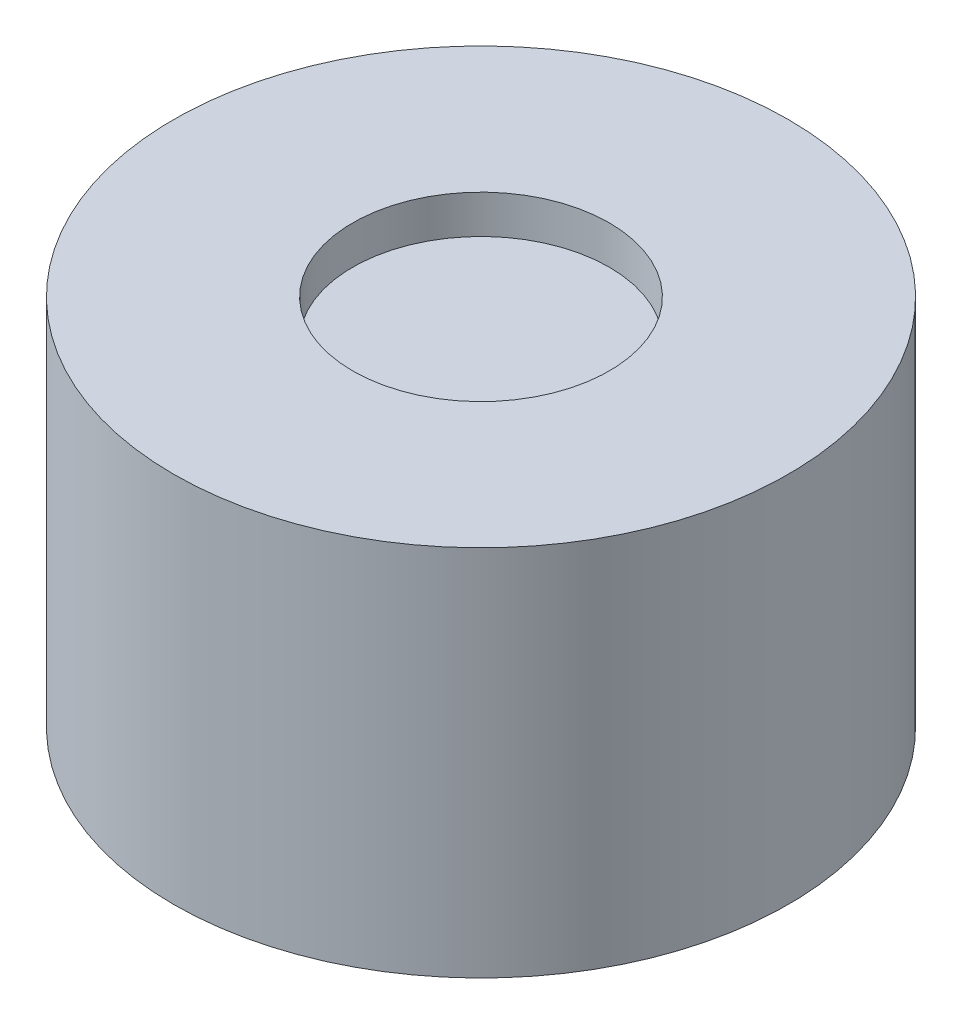
ISO-10303-21;
HEADER;
FILE_DESCRIPTION(('STEP AP214'),'2;1');
FILE_NAME('part.step','',(''),(''),'','','');
FILE_SCHEMA(('AUTOMOTIVE_DESIGN { 1 0 10303 214 1 1 1 1 }'));
ENDSEC;
DATA;
#1=APPLICATION_CONTEXT('core data for automotive mechanical design processes');
#2=APPLICATION_PROTOCOL_DEFINITION('international standard','automotive_design',2000,#1);
#3=PRODUCT_CONTEXT('',#1,'mechanical');
#4=PRODUCT('Part','Part','',(#3));
#5=PRODUCT_RELATED_PRODUCT_CATEGORY('part','',(#4));
#6=PRODUCT_DEFINITION_FORMATION('','',#4);
#7=PRODUCT_DEFINITION_CONTEXT('part definition',#1,'design');
#8=PRODUCT_DEFINITION('design','',#6,#7);
#9=PRODUCT_DEFINITION_SHAPE('','',#8);
#10=(LENGTH_UNIT() NAMED_UNIT(*) SI_UNIT(.MILLI.,.METRE.));
#11=(NAMED_UNIT(*) PLANE_ANGLE_UNIT() SI_UNIT($,.RADIAN.));
#12=(NAMED_UNIT(*) SI_UNIT($,.STERADIAN.) SOLID_ANGLE_UNIT());
#13=UNCERTAINTY_MEASURE_WITH_UNIT(LENGTH_MEASURE(1.E-05),#10,'distance_accuracy_value','');
#14=(GEOMETRIC_REPRESENTATION_CONTEXT(3) GLOBAL_UNCERTAINTY_ASSIGNED_CONTEXT((#13)) GLOBAL_UNIT_ASSIGNED_CONTEXT((#10,
#11,#12)) REPRESENTATION_CONTEXT('',''));
#15=CARTESIAN_POINT('',(0.,0.,0.));
#16=DIRECTION('',(0.,0.,1.));
#17=DIRECTION('',(1.,0.,0.));
#18=AXIS2_PLACEMENT_3D('',#15,#16,#17);
#19=CARTESIAN_POINT('',(0.,48.5,0.));
#20=DIRECTION('',(0.,-1.,0.));
#21=DIRECTION('',(0.,0.,-1.));
#22=AXIS2_PLACEMENT_3D('',#19,#20,#21);
#23=CYLINDRICAL_SURFACE('',#22,40.);
#24=CARTESIAN_POINT('',(0.,48.5,0.));
#25=DIRECTION('',(0.,1.,0.));
#26=DIRECTION('',(0.,0.,1.));
#27=AXIS2_PLACEMENT_3D('',#24,#25,#26);
#28=CIRCLE('',#27,40.);
#29=CARTESIAN_POINT('',(0.,48.5,-40.));
#30=VERTEX_POINT('',#29);
#31=EDGE_CURVE('E10',#30,#30,#28,.T.);
#32=CARTESIAN_POINT('',(0.,0.,0.));
#33=DIRECTION('',(0.,1.,0.));
#34=DIRECTION('',(0.,0.,1.));
#35=AXIS2_PLACEMENT_3D('',#32,#33,#34);
#36=CIRCLE('',#35,40.);
#37=CARTESIAN_POINT('',(0.,0.,-40.));
#38=VERTEX_POINT('',#37);
#39=EDGE_CURVE('E39',#38,#38,#36,.T.);
#40=CARTESIAN_POINT('',(0.,48.5,-40.));
#41=CARTESIAN_POINT('',(0.,47.9947916666667,-40.));
#42=CARTESIAN_POINT('',(0.,47.4895833333333,-40.));
#43=CARTESIAN_POINT('',(0.,46.4791666666667,-40.));
#44=CARTESIAN_POINT('',(0.,45.9739583333333,-40.));
#45=CARTESIAN_POINT('',(0.,44.9635416666667,-40.));
#46=CARTESIAN_POINT('',(0.,44.4583333333333,-40.));
#47=CARTESIAN_POINT('',(0.,43.4479166666667,-40.));
#48=CARTESIAN_POINT('',(0.,42.9427083333333,-40.));
#49=CARTESIAN_POINT('',(0.,41.9322916666667,-40.));
#50=CARTESIAN_POINT('',(0.,41.4270833333333,-40.));
#51=CARTESIAN_POINT('',(0.,40.4166666666667,-40.));
#52=CARTESIAN_POINT('',(0.,39.9114583333333,-40.));
#53=CARTESIAN_POINT('',(0.,38.9010416666667,-40.));
#54=CARTESIAN_POINT('',(0.,38.3958333333333,-40.));
#55=CARTESIAN_POINT('',(0.,37.3854166666667,-40.));
#56=CARTESIAN_POINT('',(0.,36.8802083333333,-40.));
#57=CARTESIAN_POINT('',(0.,35.8697916666667,-40.));
#58=CARTESIAN_POINT('',(0.,35.3645833333333,-40.));
#59=CARTESIAN_POINT('',(0.,34.3541666666667,-40.));
#60=CARTESIAN_POINT('',(0.,33.8489583333333,-40.));
#61=CARTESIAN_POINT('',(0.,32.8385416666667,-40.));
#62=CARTESIAN_POINT('',(0.,32.3333333333333,-40.));
#63=CARTESIAN_POINT('',(0.,31.3229166666667,-40.));
#64=CARTESIAN_POINT('',(0.,30.8177083333333,-40.));
#65=CARTESIAN_POINT('',(0.,29.8072916666667,-40.));
#66=CARTESIAN_POINT('',(0.,29.3020833333333,-40.));
#67=CARTESIAN_POINT('',(0.,28.2916666666667,-40.));
#68=CARTESIAN_POINT('',(0.,27.7864583333333,-40.));
#69=CARTESIAN_POINT('',(0.,26.7760416666667,-40.));
#70=CARTESIAN_POINT('',(0.,26.2708333333333,-40.));
#71=CARTESIAN_POINT('',(0.,25.2604166666667,-40.));
#72=CARTESIAN_POINT('',(0.,24.7552083333333,-40.));
#73=CARTESIAN_POINT('',(0.,23.7447916666667,-40.));
#74=CARTESIAN_POINT('',(0.,23.2395833333333,-40.));
#75=CARTESIAN_POINT('',(0.,22.2291666666667,-40.));
#76=CARTESIAN_POINT('',(0.,21.7239583333333,-40.));
#77=CARTESIAN_POINT('',(0.,20.7135416666667,-40.));
#78=CARTESIAN_POINT('',(0.,20.2083333333333,-40.));
#79=CARTESIAN_POINT('',(0.,19.1979166666667,-40.));
#80=CARTESIAN_POINT('',(0.,18.6927083333333,-40.));
#81=CARTESIAN_POINT('',(0.,17.6822916666667,-40.));
#82=CARTESIAN_POINT('',(0.,17.1770833333333,-40.));
#83=CARTESIAN_POINT('',(0.,16.1666666666667,-40.));
#84=CARTESIAN_POINT('',(0.,15.6614583333333,-40.));
#85=CARTESIAN_POINT('',(0.,14.6510416666667,-40.));
#86=CARTESIAN_POINT('',(0.,14.1458333333333,-40.));
#87=CARTESIAN_POINT('',(0.,13.1354166666667,-40.));
#88=CARTESIAN_POINT('',(0.,12.6302083333333,-40.));
#89=CARTESIAN_POINT('',(0.,11.6197916666667,-40.));
#90=CARTESIAN_POINT('',(0.,11.1145833333333,-40.));
#91=CARTESIAN_POINT('',(0.,10.1041666666667,-40.));
#92=CARTESIAN_POINT('',(0.,9.59895833333333,-40.));
#93=CARTESIAN_POINT('',(0.,8.58854166666666,-40.));
#94=CARTESIAN_POINT('',(0.,8.08333333333333,-40.));
#95=CARTESIAN_POINT('',(0.,7.07291666666666,-40.));
#96=CARTESIAN_POINT('',(0.,6.56770833333333,-40.));
#97=CARTESIAN_POINT('',(0.,5.55729166666666,-40.));
#98=CARTESIAN_POINT('',(0.,5.05208333333333,-40.));
#99=CARTESIAN_POINT('',(0.,4.04166666666666,-40.));
#100=CARTESIAN_POINT('',(0.,3.53645833333333,-40.));
#101=CARTESIAN_POINT('',(0.,2.52604166666666,-40.));
#102=CARTESIAN_POINT('',(0.,2.02083333333333,-40.));
#103=CARTESIAN_POINT('',(0.,1.01041666666666,-40.));
#104=CARTESIAN_POINT('',(0.,0.505208333333326,-40.));
#105=CARTESIAN_POINT('',(0.,0.,-40.));
#106=B_SPLINE_CURVE_WITH_KNOTS('',3,(#40,#41,#42,#43,#44,#45,#46,#47,#48,#49,#50,#51,#52,#53,
#54,#55,#56,#57,#58,#59,#60,#61,#62,#63,#64,#65,#66,#67,#68,#69,#70,#71,#72,#73,#74,#75,#76,#77,
#78,#79,#80,#81,#82,#83,#84,#85,#86,#87,#88,#89,#90,#91,#92,#93,#94,#95,#96,#97,#98,#99,#100,
#101,#102,#103,#104,#105),.UNSPECIFIED.,.F.,.F.,(4,2,2,2,2,2,2,2,2,2,2,2,2,2,2,2,2,2,2,2,2,2,2,
2,2,2,2,2,2,2,2,2,4),(0.,1.515625,3.03125,4.546875,6.0625,7.578125,9.09375,10.609375,12.125,
13.640625,15.15625,16.671875,18.1875,19.703125,21.21875,22.734375,24.25,25.765625,27.28125,
28.796875,30.3125,31.828125,33.34375,34.859375,36.375,37.890625,39.40625,40.921875,42.4375,
43.953125,45.46875,46.984375,48.5),.UNSPECIFIED.);
#107=EDGE_CURVE('BSEAM36',#30,#38,#106,.T.);
#108=ORIENTED_EDGE('',*,*,#31,.F.);
#109=ORIENTED_EDGE('',*,*,#39,.T.);
#110=ORIENTED_EDGE('',*,*,#107,.T.);
#111=ORIENTED_EDGE('',*,*,#107,.F.);
#112=EDGE_LOOP('',(#108,#110,#109,#111));
#113=FACE_BOUND('',#112,.T.);
#114=ADVANCED_FACE('F36',(#113),#23,.T.);
#115=CARTESIAN_POINT('',(0.,48.5,0.));
#116=DIRECTION('',(0.,1.,0.));
#117=DIRECTION('',(0.,0.,1.));
#118=AXIS2_PLACEMENT_3D('',#115,#116,#117);
#119=PLANE('',#118);
#120=CARTESIAN_POINT('',(0.,48.5,0.));
#121=DIRECTION('',(0.,1.,0.));
#122=DIRECTION('',(0.,0.,1.));
#123=AXIS2_PLACEMENT_3D('',#120,#121,#122);
#124=CIRCLE('',#123,16.7);
#125=CARTESIAN_POINT('',(0.,48.5,16.7));
#126=VERTEX_POINT('',#125);
#127=EDGE_CURVE('E48',#126,#126,#124,.T.);
#128=ORIENTED_EDGE('',*,*,#127,.F.);
#129=EDGE_LOOP('',(#128));
#130=FACE_BOUND('',#129,.T.);
#131=ORIENTED_EDGE('',*,*,#31,.T.);
#132=EDGE_LOOP('',(#131));
#133=FACE_BOUND('',#132,.T.);
#134=ADVANCED_FACE('F63',(#130,#133),#119,.T.);
#135=CARTESIAN_POINT('',(0.,0.,0.));
#136=DIRECTION('',(0.,1.,0.));
#137=DIRECTION('',(0.,0.,1.));
#138=AXIS2_PLACEMENT_3D('',#135,#136,#137);
#139=PLANE('',#138);
#140=ORIENTED_EDGE('',*,*,#39,.F.);
#141=EDGE_LOOP('',(#140));
#142=FACE_BOUND('',#141,.T.);
#143=ADVANCED_FACE('F59',(#142),#139,.F.);
#144=CARTESIAN_POINT('',(0.,43.5,0.));
#145=DIRECTION('',(0.,1.,0.));
#146=DIRECTION('',(0.,0.,1.));
#147=AXIS2_PLACEMENT_3D('',#144,#145,#146);
#148=CYLINDRICAL_SURFACE('',#147,16.7);
#149=CARTESIAN_POINT('',(0.,43.5,0.));
#150=DIRECTION('',(0.,1.,0.));
#151=DIRECTION('',(0.,0.,1.));
#152=AXIS2_PLACEMENT_3D('',#149,#150,#151);
#153=CIRCLE('',#152,16.7);
#154=CARTESIAN_POINT('',(0.,43.5,16.7));
#155=VERTEX_POINT('',#154);
#156=EDGE_CURVE('E46',#155,#155,#153,.T.);
#157=ORIENTED_EDGE('',*,*,#156,.F.);
#158=EDGE_LOOP('',(#157));
#159=FACE_BOUND('',#158,.T.);
#160=ORIENTED_EDGE('',*,*,#127,.T.);
#161=EDGE_LOOP('',(#160));
#162=FACE_BOUND('',#161,.T.);
#163=ADVANCED_FACE('F56',(#159,#162),#148,.F.);
#164=CARTESIAN_POINT('',(0.,43.5,0.));
#165=DIRECTION('',(0.,1.,0.));
#166=DIRECTION('',(0.,0.,1.));
#167=AXIS2_PLACEMENT_3D('',#164,#165,#166);
#168=PLANE('',#167);
#169=ORIENTED_EDGE('',*,*,#156,.T.);
#170=EDGE_LOOP('',(#169));
#171=FACE_BOUND('',#170,.T.);
#172=ADVANCED_FACE('F54',(#171),#168,.T.);
#173=CLOSED_SHELL('',(#114,#134,#143,#163,#172));
#174=MANIFOLD_SOLID_BREP('B2',#173);
#175=ADVANCED_BREP_SHAPE_REPRESENTATION('',(#18,#174),#14);
#176=SHAPE_DEFINITION_REPRESENTATION(#9,#175);
ENDSEC;
END-ISO-10303-21;
